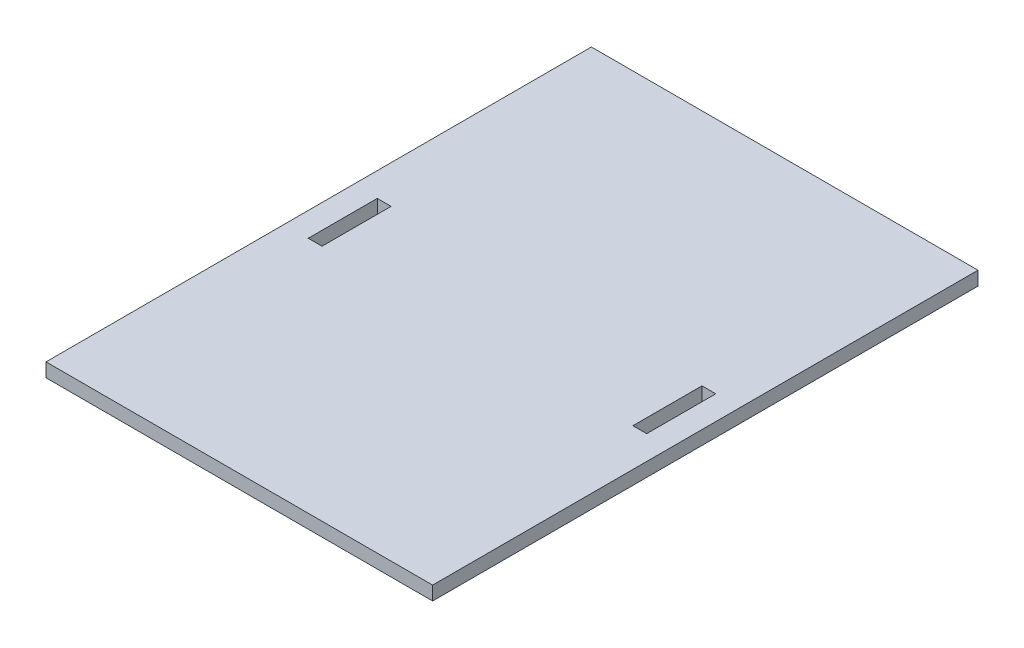
ISO-10303-21;
HEADER;
FILE_DESCRIPTION(('STEP AP214'),'2;1');
FILE_NAME('part.step','',(''),(''),'','','');
FILE_SCHEMA(('AUTOMOTIVE_DESIGN { 1 0 10303 214 1 1 1 1 }'));
ENDSEC;
DATA;
#1=APPLICATION_CONTEXT('core data for automotive mechanical design processes');
#2=APPLICATION_PROTOCOL_DEFINITION('international standard','automotive_design',2000,#1);
#3=PRODUCT_CONTEXT('',#1,'mechanical');
#4=PRODUCT('Part','Part','',(#3));
#5=PRODUCT_RELATED_PRODUCT_CATEGORY('part','',(#4));
#6=PRODUCT_DEFINITION_FORMATION('','',#4);
#7=PRODUCT_DEFINITION_CONTEXT('part definition',#1,'design');
#8=PRODUCT_DEFINITION('design','',#6,#7);
#9=PRODUCT_DEFINITION_SHAPE('','',#8);
#10=(LENGTH_UNIT() NAMED_UNIT(*) SI_UNIT(.MILLI.,.METRE.));
#11=(NAMED_UNIT(*) PLANE_ANGLE_UNIT() SI_UNIT($,.RADIAN.));
#12=(NAMED_UNIT(*) SI_UNIT($,.STERADIAN.) SOLID_ANGLE_UNIT());
#13=UNCERTAINTY_MEASURE_WITH_UNIT(LENGTH_MEASURE(1.E-05),#10,'distance_accuracy_value','');
#14=(GEOMETRIC_REPRESENTATION_CONTEXT(3) GLOBAL_UNCERTAINTY_ASSIGNED_CONTEXT((#13)) GLOBAL_UNIT_ASSIGNED_CONTEXT((#10,
#11,#12)) REPRESENTATION_CONTEXT('',''));
#15=CARTESIAN_POINT('',(0.,0.,0.));
#16=DIRECTION('',(0.,0.,1.));
#17=DIRECTION('',(1.,0.,0.));
#18=AXIS2_PLACEMENT_3D('',#15,#16,#17);
#19=CARTESIAN_POINT('',(27.9999999999998,-54.9530941541441,79.));
#20=DIRECTION('',(-1.,0.,0.));
#21=DIRECTION('',(0.,-1.,0.));
#22=AXIS2_PLACEMENT_3D('',#19,#20,#21);
#23=PLANE('',#22);
#24=DIRECTION('',(0.,1.,0.));
#25=VECTOR('',#24,1.);
#26=CARTESIAN_POINT('',(27.9999999999998,-54.9530941541441,0.));
#27=LINE('',#26,#25);
#28=CARTESIAN_POINT('',(27.9999999999998,-54.9530941541441,0.));
#29=VERTEX_POINT('',#28);
#30=CARTESIAN_POINT('',(27.9999999999998,-52.9530941541441,0.));
#31=VERTEX_POINT('',#30);
#32=EDGE_CURVE('E197',#29,#31,#27,.T.);
#33=ORIENTED_EDGE('',*,*,#32,.T.);
#34=DIRECTION('',(0.,0.,-1.));
#35=VECTOR('',#34,1.);
#36=CARTESIAN_POINT('',(27.9999999999998,-52.9530941541441,79.));
#37=LINE('',#36,#35);
#38=CARTESIAN_POINT('',(27.9999999999998,-52.9530941541441,79.));
#39=VERTEX_POINT('',#38);
#40=EDGE_CURVE('E11',#39,#31,#37,.T.);
#41=ORIENTED_EDGE('',*,*,#40,.F.);
#42=DIRECTION('',(0.,1.,0.));
#43=VECTOR('',#42,1.);
#44=CARTESIAN_POINT('',(27.9999999999998,-54.9530941541441,79.));
#45=LINE('',#44,#43);
#46=CARTESIAN_POINT('',(27.9999999999998,-54.9530941541441,79.));
#47=VERTEX_POINT('',#46);
#48=EDGE_CURVE('E198',#47,#39,#45,.T.);
#49=ORIENTED_EDGE('',*,*,#48,.F.);
#50=DIRECTION('',(0.,0.,-1.));
#51=VECTOR('',#50,1.);
#52=CARTESIAN_POINT('',(27.9999999999998,-54.9530941541441,79.));
#53=LINE('',#52,#51);
#54=EDGE_CURVE('E208',#47,#29,#53,.T.);
#55=ORIENTED_EDGE('',*,*,#54,.T.);
#56=EDGE_LOOP('',(#33,#41,#49,#55));
#57=FACE_BOUND('',#56,.T.);
#58=ADVANCED_FACE('F39',(#57),#23,.F.);
#59=CARTESIAN_POINT('',(-28.0000000000002,-52.9530941541441,79.));
#60=DIRECTION('',(0.,-1.,0.));
#61=DIRECTION('',(0.,0.,-1.));
#62=AXIS2_PLACEMENT_3D('',#59,#60,#61);
#63=PLANE('',#62);
#64=DIRECTION('',(1.,0.,0.));
#65=VECTOR('',#64,1.);
#66=CARTESIAN_POINT('',(-28.0000000000002,-52.9530941541441,34.5));
#67=LINE('',#66,#65);
#68=CARTESIAN_POINT('',(-24.515,-52.9530941541441,34.5));
#69=VERTEX_POINT('',#68);
#70=CARTESIAN_POINT('',(-22.515,-52.9530941541441,34.5));
#71=VERTEX_POINT('',#70);
#72=EDGE_CURVE('E191',#69,#71,#67,.T.);
#73=ORIENTED_EDGE('',*,*,#72,.T.);
#74=DIRECTION('',(0.,0.,1.));
#75=VECTOR('',#74,1.);
#76=CARTESIAN_POINT('',(-22.515,-52.9530941541441,79.));
#77=LINE('',#76,#75);
#78=CARTESIAN_POINT('',(-22.515,-52.9530941541441,44.5));
#79=VERTEX_POINT('',#78);
#80=EDGE_CURVE('E194',#71,#79,#77,.T.);
#81=ORIENTED_EDGE('',*,*,#80,.T.);
#82=DIRECTION('',(-1.,0.,0.));
#83=VECTOR('',#82,1.);
#84=CARTESIAN_POINT('',(-28.0000000000002,-52.9530941541441,44.5));
#85=LINE('',#84,#83);
#86=CARTESIAN_POINT('',(-24.515,-52.9530941541441,44.5));
#87=VERTEX_POINT('',#86);
#88=EDGE_CURVE('E188',#79,#87,#85,.T.);
#89=ORIENTED_EDGE('',*,*,#88,.T.);
#90=DIRECTION('',(0.,0.,-1.));
#91=VECTOR('',#90,1.);
#92=CARTESIAN_POINT('',(-24.515,-52.9530941541441,79.));
#93=LINE('',#92,#91);
#94=EDGE_CURVE('E132',#87,#69,#93,.T.);
#95=ORIENTED_EDGE('',*,*,#94,.T.);
#96=EDGE_LOOP('',(#73,#81,#89,#95));
#97=FACE_BOUND('',#96,.T.);
#98=DIRECTION('',(1.,0.,0.));
#99=VECTOR('',#98,1.);
#100=CARTESIAN_POINT('',(-28.0000000000002,-52.9530941541441,34.5));
#101=LINE('',#100,#99);
#102=CARTESIAN_POINT('',(22.515,-52.9530941541441,34.5));
#103=VERTEX_POINT('',#102);
#104=CARTESIAN_POINT('',(24.515,-52.9530941541441,34.5));
#105=VERTEX_POINT('',#104);
#106=EDGE_CURVE('E182',#103,#105,#101,.T.);
#107=ORIENTED_EDGE('',*,*,#106,.T.);
#108=DIRECTION('',(0.,0.,1.));
#109=VECTOR('',#108,1.);
#110=CARTESIAN_POINT('',(24.515,-52.9530941541441,79.));
#111=LINE('',#110,#109);
#112=CARTESIAN_POINT('',(24.515,-52.9530941541441,44.5));
#113=VERTEX_POINT('',#112);
#114=EDGE_CURVE('E185',#105,#113,#111,.T.);
#115=ORIENTED_EDGE('',*,*,#114,.T.);
#116=DIRECTION('',(-1.,0.,0.));
#117=VECTOR('',#116,1.);
#118=CARTESIAN_POINT('',(-28.0000000000002,-52.9530941541441,44.5));
#119=LINE('',#118,#117);
#120=CARTESIAN_POINT('',(22.515,-52.9530941541441,44.5));
#121=VERTEX_POINT('',#120);
#122=EDGE_CURVE('E156',#113,#121,#119,.T.);
#123=ORIENTED_EDGE('',*,*,#122,.T.);
#124=DIRECTION('',(0.,0.,-1.));
#125=VECTOR('',#124,1.);
#126=CARTESIAN_POINT('',(22.515,-52.9530941541441,79.));
#127=LINE('',#126,#125);
#128=EDGE_CURVE('E179',#121,#103,#127,.T.);
#129=ORIENTED_EDGE('',*,*,#128,.T.);
#130=EDGE_LOOP('',(#107,#115,#123,#129));
#131=FACE_BOUND('',#130,.T.);
#132=DIRECTION('',(-1.,0.,0.));
#133=VECTOR('',#132,1.);
#134=CARTESIAN_POINT('',(-28.0000000000002,-52.9530941541441,0.));
#135=LINE('',#134,#133);
#136=CARTESIAN_POINT('',(-28.0000000000002,-52.9530941541441,0.));
#137=VERTEX_POINT('',#136);
#138=EDGE_CURVE('E211',#31,#137,#135,.T.);
#139=ORIENTED_EDGE('',*,*,#138,.T.);
#140=DIRECTION('',(0.,0.,-1.));
#141=VECTOR('',#140,1.);
#142=CARTESIAN_POINT('',(-28.0000000000002,-52.9530941541441,79.));
#143=LINE('',#142,#141);
#144=CARTESIAN_POINT('',(-28.0000000000002,-52.9530941541441,79.));
#145=VERTEX_POINT('',#144);
#146=EDGE_CURVE('E46',#145,#137,#143,.T.);
#147=ORIENTED_EDGE('',*,*,#146,.F.);
#148=DIRECTION('',(-1.,0.,0.));
#149=VECTOR('',#148,1.);
#150=CARTESIAN_POINT('',(-28.0000000000002,-52.9530941541441,79.));
#151=LINE('',#150,#149);
#152=EDGE_CURVE('E201',#39,#145,#151,.T.);
#153=ORIENTED_EDGE('',*,*,#152,.F.);
#154=ORIENTED_EDGE('',*,*,#40,.T.);
#155=EDGE_LOOP('',(#139,#147,#153,#154));
#156=FACE_BOUND('',#155,.T.);
#157=ADVANCED_FACE('F240',(#97,#131,#156),#63,.F.);
#158=CARTESIAN_POINT('',(-28.0000000000002,-52.9530941541441,79.));
#159=DIRECTION('',(1.,0.,0.));
#160=DIRECTION('',(0.,0.,-1.));
#161=AXIS2_PLACEMENT_3D('',#158,#159,#160);
#162=PLANE('',#161);
#163=DIRECTION('',(0.,-1.,0.));
#164=VECTOR('',#163,1.);
#165=CARTESIAN_POINT('',(-28.0000000000002,-52.9530941541441,0.));
#166=LINE('',#165,#164);
#167=CARTESIAN_POINT('',(-28.0000000000002,-54.9530941541441,0.));
#168=VERTEX_POINT('',#167);
#169=EDGE_CURVE('E213',#137,#168,#166,.T.);
#170=ORIENTED_EDGE('',*,*,#169,.T.);
#171=DIRECTION('',(0.,0.,-1.));
#172=VECTOR('',#171,1.);
#173=CARTESIAN_POINT('',(-28.0000000000002,-54.9530941541441,79.));
#174=LINE('',#173,#172);
#175=CARTESIAN_POINT('',(-28.0000000000002,-54.9530941541441,79.));
#176=VERTEX_POINT('',#175);
#177=EDGE_CURVE('E218',#176,#168,#174,.T.);
#178=ORIENTED_EDGE('',*,*,#177,.F.);
#179=DIRECTION('',(0.,-1.,0.));
#180=VECTOR('',#179,1.);
#181=CARTESIAN_POINT('',(-28.0000000000002,-52.9530941541441,79.));
#182=LINE('',#181,#180);
#183=EDGE_CURVE('E204',#145,#176,#182,.T.);
#184=ORIENTED_EDGE('',*,*,#183,.F.);
#185=ORIENTED_EDGE('',*,*,#146,.T.);
#186=EDGE_LOOP('',(#170,#178,#184,#185));
#187=FACE_BOUND('',#186,.T.);
#188=ADVANCED_FACE('F225',(#187),#162,.F.);
#189=CARTESIAN_POINT('',(-28.0000000000002,-54.9530941541441,79.));
#190=DIRECTION('',(0.,1.,0.));
#191=DIRECTION('',(0.,0.,1.));
#192=AXIS2_PLACEMENT_3D('',#189,#190,#191);
#193=PLANE('',#192);
#194=DIRECTION('',(-1.,0.,0.));
#195=VECTOR('',#194,1.);
#196=CARTESIAN_POINT('',(-24.515,-54.9530941541441,44.5));
#197=LINE('',#196,#195);
#198=CARTESIAN_POINT('',(-22.515,-54.9530941541441,44.5));
#199=VERTEX_POINT('',#198);
#200=CARTESIAN_POINT('',(-24.515,-54.9530941541441,44.5));
#201=VERTEX_POINT('',#200);
#202=EDGE_CURVE('E139',#199,#201,#197,.T.);
#203=ORIENTED_EDGE('',*,*,#202,.F.);
#204=DIRECTION('',(0.,0.,1.));
#205=VECTOR('',#204,1.);
#206=CARTESIAN_POINT('',(-22.515,-54.9530941541441,34.5));
#207=LINE('',#206,#205);
#208=CARTESIAN_POINT('',(-22.515,-54.9530941541441,34.5));
#209=VERTEX_POINT('',#208);
#210=EDGE_CURVE('E144',#209,#199,#207,.T.);
#211=ORIENTED_EDGE('',*,*,#210,.F.);
#212=DIRECTION('',(1.,0.,0.));
#213=VECTOR('',#212,1.);
#214=CARTESIAN_POINT('',(-24.515,-54.9530941541441,34.5));
#215=LINE('',#214,#213);
#216=CARTESIAN_POINT('',(-24.515,-54.9530941541441,34.5));
#217=VERTEX_POINT('',#216);
#218=EDGE_CURVE('E149',#217,#209,#215,.T.);
#219=ORIENTED_EDGE('',*,*,#218,.F.);
#220=DIRECTION('',(0.,0.,-1.));
#221=VECTOR('',#220,1.);
#222=CARTESIAN_POINT('',(-24.515,-54.9530941541441,34.5));
#223=LINE('',#222,#221);
#224=EDGE_CURVE('E129',#201,#217,#223,.T.);
#225=ORIENTED_EDGE('',*,*,#224,.F.);
#226=EDGE_LOOP('',(#203,#211,#219,#225));
#227=FACE_BOUND('',#226,.T.);
#228=DIRECTION('',(-1.,0.,0.));
#229=VECTOR('',#228,1.);
#230=CARTESIAN_POINT('',(24.515,-54.9530941541441,44.5));
#231=LINE('',#230,#229);
#232=CARTESIAN_POINT('',(24.515,-54.9530941541441,44.5));
#233=VERTEX_POINT('',#232);
#234=CARTESIAN_POINT('',(22.515,-54.9530941541441,44.5));
#235=VERTEX_POINT('',#234);
#236=EDGE_CURVE('E173',#233,#235,#231,.T.);
#237=ORIENTED_EDGE('',*,*,#236,.F.);
#238=DIRECTION('',(0.,0.,1.));
#239=VECTOR('',#238,1.);
#240=CARTESIAN_POINT('',(24.515,-54.9530941541441,34.5));
#241=LINE('',#240,#239);
#242=CARTESIAN_POINT('',(24.515,-54.9530941541441,34.5));
#243=VERTEX_POINT('',#242);
#244=EDGE_CURVE('E175',#243,#233,#241,.T.);
#245=ORIENTED_EDGE('',*,*,#244,.F.);
#246=DIRECTION('',(1.,0.,0.));
#247=VECTOR('',#246,1.);
#248=CARTESIAN_POINT('',(24.515,-54.9530941541441,34.5));
#249=LINE('',#248,#247);
#250=CARTESIAN_POINT('',(22.515,-54.9530941541441,34.5));
#251=VERTEX_POINT('',#250);
#252=EDGE_CURVE('E162',#251,#243,#249,.T.);
#253=ORIENTED_EDGE('',*,*,#252,.F.);
#254=DIRECTION('',(0.,0.,-1.));
#255=VECTOR('',#254,1.);
#256=CARTESIAN_POINT('',(22.515,-54.9530941541441,34.5));
#257=LINE('',#256,#255);
#258=EDGE_CURVE('E170',#235,#251,#257,.T.);
#259=ORIENTED_EDGE('',*,*,#258,.F.);
#260=EDGE_LOOP('',(#237,#245,#253,#259));
#261=FACE_BOUND('',#260,.T.);
#262=DIRECTION('',(1.,0.,0.));
#263=VECTOR('',#262,1.);
#264=CARTESIAN_POINT('',(-28.0000000000002,-54.9530941541441,0.));
#265=LINE('',#264,#263);
#266=EDGE_CURVE('E202',#168,#29,#265,.T.);
#267=ORIENTED_EDGE('',*,*,#266,.T.);
#268=ORIENTED_EDGE('',*,*,#54,.F.);
#269=DIRECTION('',(1.,0.,0.));
#270=VECTOR('',#269,1.);
#271=CARTESIAN_POINT('',(-28.0000000000002,-54.9530941541441,79.));
#272=LINE('',#271,#270);
#273=EDGE_CURVE('E206',#176,#47,#272,.T.);
#274=ORIENTED_EDGE('',*,*,#273,.F.);
#275=ORIENTED_EDGE('',*,*,#177,.T.);
#276=EDGE_LOOP('',(#267,#268,#274,#275));
#277=FACE_BOUND('',#276,.T.);
#278=ADVANCED_FACE('F146',(#227,#261,#277),#193,.F.);
#279=CARTESIAN_POINT('',(0.,0.,79.));
#280=DIRECTION('',(0.,0.,-1.));
#281=DIRECTION('',(-1.,0.,0.));
#282=AXIS2_PLACEMENT_3D('',#279,#280,#281);
#283=PLANE('',#282);
#284=ORIENTED_EDGE('',*,*,#48,.T.);
#285=ORIENTED_EDGE('',*,*,#152,.T.);
#286=ORIENTED_EDGE('',*,*,#183,.T.);
#287=ORIENTED_EDGE('',*,*,#273,.T.);
#288=EDGE_LOOP('',(#284,#285,#286,#287));
#289=FACE_BOUND('',#288,.T.);
#290=ADVANCED_FACE('F239',(#289),#283,.F.);
#291=CARTESIAN_POINT('',(0.,0.,0.));
#292=DIRECTION('',(0.,0.,-1.));
#293=DIRECTION('',(-1.,0.,0.));
#294=AXIS2_PLACEMENT_3D('',#291,#292,#293);
#295=PLANE('',#294);
#296=ORIENTED_EDGE('',*,*,#32,.F.);
#297=ORIENTED_EDGE('',*,*,#266,.F.);
#298=ORIENTED_EDGE('',*,*,#169,.F.);
#299=ORIENTED_EDGE('',*,*,#138,.F.);
#300=EDGE_LOOP('',(#296,#297,#298,#299));
#301=FACE_BOUND('',#300,.T.);
#302=ADVANCED_FACE('F231',(#301),#295,.T.);
#303=CARTESIAN_POINT('',(24.515,24.0469058458559,34.5));
#304=DIRECTION('',(1.,0.,0.));
#305=DIRECTION('',(0.,0.,-1.));
#306=AXIS2_PLACEMENT_3D('',#303,#304,#305);
#307=PLANE('',#306);
#308=DIRECTION('',(0.,-1.,0.));
#309=VECTOR('',#308,1.);
#310=CARTESIAN_POINT('',(24.515,24.0469058458559,34.5));
#311=LINE('',#310,#309);
#312=EDGE_CURVE('E166',#105,#243,#311,.T.);
#313=ORIENTED_EDGE('',*,*,#312,.T.);
#314=ORIENTED_EDGE('',*,*,#244,.T.);
#315=DIRECTION('',(0.,-1.,0.));
#316=VECTOR('',#315,1.);
#317=CARTESIAN_POINT('',(24.515,24.0469058458559,44.5));
#318=LINE('',#317,#316);
#319=EDGE_CURVE('E159',#113,#233,#318,.T.);
#320=ORIENTED_EDGE('',*,*,#319,.F.);
#321=ORIENTED_EDGE('',*,*,#114,.F.);
#322=EDGE_LOOP('',(#313,#314,#320,#321));
#323=FACE_BOUND('',#322,.T.);
#324=ADVANCED_FACE('F254',(#323),#307,.F.);
#325=CARTESIAN_POINT('',(24.515,24.0469058458559,34.5));
#326=DIRECTION('',(0.,0.,-1.));
#327=DIRECTION('',(-1.,0.,0.));
#328=AXIS2_PLACEMENT_3D('',#325,#326,#327);
#329=PLANE('',#328);
#330=DIRECTION('',(0.,-1.,0.));
#331=VECTOR('',#330,1.);
#332=CARTESIAN_POINT('',(22.515,24.0469058458559,34.5));
#333=LINE('',#332,#331);
#334=EDGE_CURVE('E164',#103,#251,#333,.T.);
#335=ORIENTED_EDGE('',*,*,#334,.T.);
#336=ORIENTED_EDGE('',*,*,#252,.T.);
#337=ORIENTED_EDGE('',*,*,#312,.F.);
#338=ORIENTED_EDGE('',*,*,#106,.F.);
#339=EDGE_LOOP('',(#335,#336,#337,#338));
#340=FACE_BOUND('',#339,.T.);
#341=ADVANCED_FACE('F257',(#340),#329,.F.);
#342=CARTESIAN_POINT('',(22.515,24.0469058458559,34.5));
#343=DIRECTION('',(-1.,0.,0.));
#344=DIRECTION('',(0.,0.,1.));
#345=AXIS2_PLACEMENT_3D('',#342,#343,#344);
#346=PLANE('',#345);
#347=DIRECTION('',(0.,-1.,0.));
#348=VECTOR('',#347,1.);
#349=CARTESIAN_POINT('',(22.515,24.0469058458559,44.5));
#350=LINE('',#349,#348);
#351=EDGE_CURVE('E61',#121,#235,#350,.T.);
#352=ORIENTED_EDGE('',*,*,#351,.T.);
#353=ORIENTED_EDGE('',*,*,#258,.T.);
#354=ORIENTED_EDGE('',*,*,#334,.F.);
#355=ORIENTED_EDGE('',*,*,#128,.F.);
#356=EDGE_LOOP('',(#352,#353,#354,#355));
#357=FACE_BOUND('',#356,.T.);
#358=ADVANCED_FACE('F260',(#357),#346,.F.);
#359=CARTESIAN_POINT('',(24.515,24.0469058458559,44.5));
#360=DIRECTION('',(0.,0.,1.));
#361=DIRECTION('',(1.,0.,0.));
#362=AXIS2_PLACEMENT_3D('',#359,#360,#361);
#363=PLANE('',#362);
#364=ORIENTED_EDGE('',*,*,#319,.T.);
#365=ORIENTED_EDGE('',*,*,#236,.T.);
#366=ORIENTED_EDGE('',*,*,#351,.F.);
#367=ORIENTED_EDGE('',*,*,#122,.F.);
#368=EDGE_LOOP('',(#364,#365,#366,#367));
#369=FACE_BOUND('',#368,.T.);
#370=ADVANCED_FACE('F264',(#369),#363,.F.);
#371=CARTESIAN_POINT('',(-22.515,24.0469058458559,34.5));
#372=DIRECTION('',(1.,0.,0.));
#373=DIRECTION('',(0.,0.,-1.));
#374=AXIS2_PLACEMENT_3D('',#371,#372,#373);
#375=PLANE('',#374);
#376=DIRECTION('',(0.,-1.,0.));
#377=VECTOR('',#376,1.);
#378=CARTESIAN_POINT('',(-22.515,24.0469058458559,34.5));
#379=LINE('',#378,#377);
#380=EDGE_CURVE('E154',#71,#209,#379,.T.);
#381=ORIENTED_EDGE('',*,*,#380,.T.);
#382=ORIENTED_EDGE('',*,*,#210,.T.);
#383=DIRECTION('',(0.,-1.,0.));
#384=VECTOR('',#383,1.);
#385=CARTESIAN_POINT('',(-22.515,24.0469058458559,44.5));
#386=LINE('',#385,#384);
#387=EDGE_CURVE('E135',#79,#199,#386,.T.);
#388=ORIENTED_EDGE('',*,*,#387,.F.);
#389=ORIENTED_EDGE('',*,*,#80,.F.);
#390=EDGE_LOOP('',(#381,#382,#388,#389));
#391=FACE_BOUND('',#390,.T.);
#392=ADVANCED_FACE('F268',(#391),#375,.F.);
#393=CARTESIAN_POINT('',(-24.515,24.0469058458559,34.5));
#394=DIRECTION('',(0.,0.,-1.));
#395=DIRECTION('',(-1.,0.,0.));
#396=AXIS2_PLACEMENT_3D('',#393,#394,#395);
#397=PLANE('',#396);
#398=DIRECTION('',(0.,-1.,0.));
#399=VECTOR('',#398,1.);
#400=CARTESIAN_POINT('',(-24.515,24.0469058458559,34.5));
#401=LINE('',#400,#399);
#402=EDGE_CURVE('E134',#69,#217,#401,.T.);
#403=ORIENTED_EDGE('',*,*,#402,.T.);
#404=ORIENTED_EDGE('',*,*,#218,.T.);
#405=ORIENTED_EDGE('',*,*,#380,.F.);
#406=ORIENTED_EDGE('',*,*,#72,.F.);
#407=EDGE_LOOP('',(#403,#404,#405,#406));
#408=FACE_BOUND('',#407,.T.);
#409=ADVANCED_FACE('F274',(#408),#397,.F.);
#410=CARTESIAN_POINT('',(-24.515,24.0469058458559,34.5));
#411=DIRECTION('',(-1.,0.,0.));
#412=DIRECTION('',(0.,0.,1.));
#413=AXIS2_PLACEMENT_3D('',#410,#411,#412);
#414=PLANE('',#413);
#415=DIRECTION('',(0.,-1.,0.));
#416=VECTOR('',#415,1.);
#417=CARTESIAN_POINT('',(-24.515,24.0469058458559,44.5));
#418=LINE('',#417,#416);
#419=EDGE_CURVE('E53',#87,#201,#418,.T.);
#420=ORIENTED_EDGE('',*,*,#419,.T.);
#421=ORIENTED_EDGE('',*,*,#224,.T.);
#422=ORIENTED_EDGE('',*,*,#402,.F.);
#423=ORIENTED_EDGE('',*,*,#94,.F.);
#424=EDGE_LOOP('',(#420,#421,#422,#423));
#425=FACE_BOUND('',#424,.T.);
#426=ADVANCED_FACE('F126',(#425),#414,.F.);
#427=CARTESIAN_POINT('',(-24.515,24.0469058458559,44.5));
#428=DIRECTION('',(0.,0.,1.));
#429=DIRECTION('',(1.,0.,0.));
#430=AXIS2_PLACEMENT_3D('',#427,#428,#429);
#431=PLANE('',#430);
#432=ORIENTED_EDGE('',*,*,#387,.T.);
#433=ORIENTED_EDGE('',*,*,#202,.T.);
#434=ORIENTED_EDGE('',*,*,#419,.F.);
#435=ORIENTED_EDGE('',*,*,#88,.F.);
#436=EDGE_LOOP('',(#432,#433,#434,#435));
#437=FACE_BOUND('',#436,.T.);
#438=ADVANCED_FACE('F140',(#437),#431,.F.);
#439=CLOSED_SHELL('',(#58,#157,#188,#278,#290,#302,#324,#341,#358,#370,#392,#409,#426,#438));
#440=MANIFOLD_SOLID_BREP('B2',#439);
#441=ADVANCED_BREP_SHAPE_REPRESENTATION('',(#18,#440),#14);
#442=SHAPE_DEFINITION_REPRESENTATION(#9,#441);
ENDSEC;
END-ISO-10303-21;
